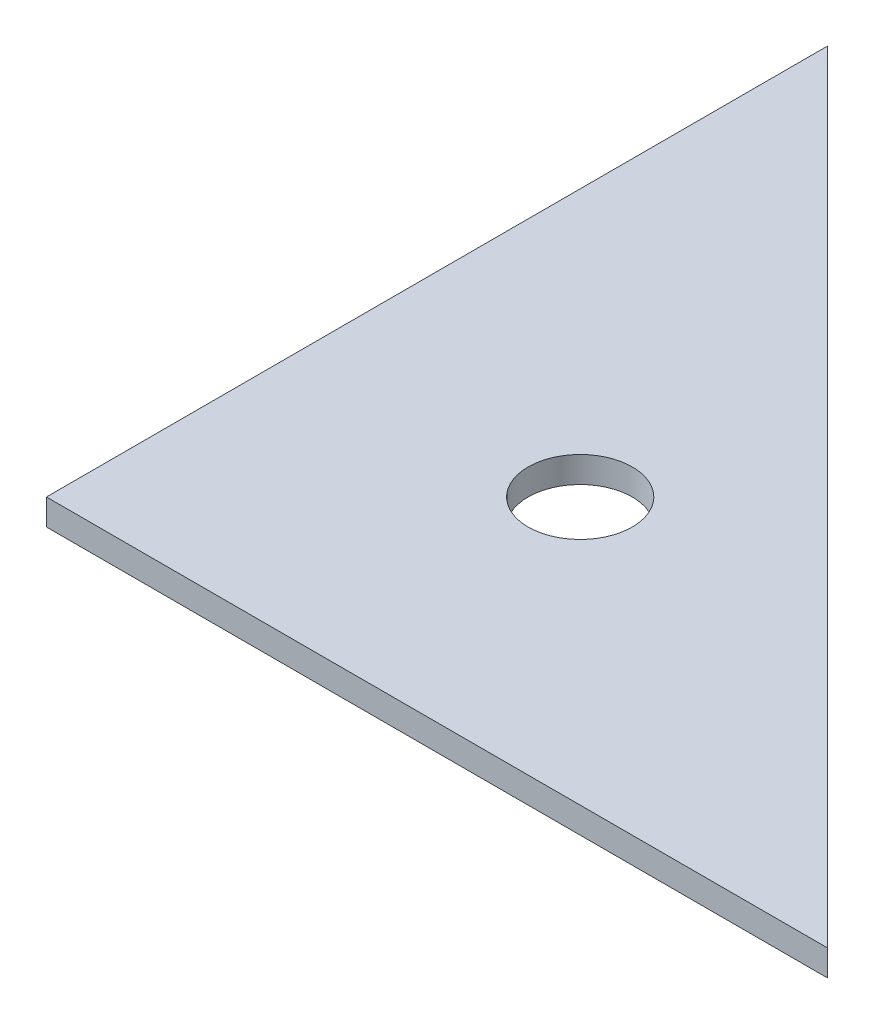
ISO-10303-21;
HEADER;
FILE_DESCRIPTION(('STEP AP214'),'2;1');
FILE_NAME('part.step','',(''),(''),'','','');
FILE_SCHEMA(('AUTOMOTIVE_DESIGN { 1 0 10303 214 1 1 1 1 }'));
ENDSEC;
DATA;
#1=APPLICATION_CONTEXT('core data for automotive mechanical design processes');
#2=APPLICATION_PROTOCOL_DEFINITION('international standard','automotive_design',2000,#1);
#3=PRODUCT_CONTEXT('',#1,'mechanical');
#4=PRODUCT('Part','Part','',(#3));
#5=PRODUCT_RELATED_PRODUCT_CATEGORY('part','',(#4));
#6=PRODUCT_DEFINITION_FORMATION('','',#4);
#7=PRODUCT_DEFINITION_CONTEXT('part definition',#1,'design');
#8=PRODUCT_DEFINITION('design','',#6,#7);
#9=PRODUCT_DEFINITION_SHAPE('','',#8);
#10=(LENGTH_UNIT() NAMED_UNIT(*) SI_UNIT(.MILLI.,.METRE.));
#11=(NAMED_UNIT(*) PLANE_ANGLE_UNIT() SI_UNIT($,.RADIAN.));
#12=(NAMED_UNIT(*) SI_UNIT($,.STERADIAN.) SOLID_ANGLE_UNIT());
#13=UNCERTAINTY_MEASURE_WITH_UNIT(LENGTH_MEASURE(1.E-05),#10,'distance_accuracy_value','');
#14=(GEOMETRIC_REPRESENTATION_CONTEXT(3) GLOBAL_UNCERTAINTY_ASSIGNED_CONTEXT((#13)) GLOBAL_UNIT_ASSIGNED_CONTEXT((#10,
#11,#12)) REPRESENTATION_CONTEXT('',''));
#15=CARTESIAN_POINT('',(0.,0.,0.));
#16=DIRECTION('',(0.,0.,1.));
#17=DIRECTION('',(1.,0.,0.));
#18=AXIS2_PLACEMENT_3D('',#15,#16,#17);
#19=CARTESIAN_POINT('',(0.,2.,0.));
#20=DIRECTION('',(0.,-1.,0.));
#21=DIRECTION('',(0.,0.,-1.));
#22=AXIS2_PLACEMENT_3D('',#19,#20,#21);
#23=PLANE('',#22);
#24=DIRECTION('',(0.,0.,1.));
#25=VECTOR('',#24,1.);
#26=CARTESIAN_POINT('',(0.,2.,0.));
#27=LINE('',#26,#25);
#28=CARTESIAN_POINT('',(0.,2.,-60.));
#29=VERTEX_POINT('',#28);
#30=CARTESIAN_POINT('',(0.,2.,0.));
#31=VERTEX_POINT('',#30);
#32=EDGE_CURVE('E86',#29,#31,#27,.T.);
#33=ORIENTED_EDGE('',*,*,#32,.T.);
#34=DIRECTION('',(1.,0.,0.));
#35=VECTOR('',#34,1.);
#36=CARTESIAN_POINT('',(0.,2.,0.));
#37=LINE('',#36,#35);
#38=CARTESIAN_POINT('',(60.,2.,0.));
#39=VERTEX_POINT('',#38);
#40=EDGE_CURVE('E82',#31,#39,#37,.T.);
#41=ORIENTED_EDGE('',*,*,#40,.T.);
#42=DIRECTION('',(-0.707106781186547,0.,-0.707106781186547));
#43=VECTOR('',#42,1.);
#44=CARTESIAN_POINT('',(0.,2.,-60.));
#45=LINE('',#44,#43);
#46=EDGE_CURVE('E62',#39,#29,#45,.T.);
#47=ORIENTED_EDGE('',*,*,#46,.T.);
#48=EDGE_LOOP('',(#33,#41,#47));
#49=FACE_BOUND('',#48,.T.);
#50=CARTESIAN_POINT('',(20.5,2.,-20.5));
#51=DIRECTION('',(0.,1.,0.));
#52=DIRECTION('',(0.,0.,1.));
#53=AXIS2_PLACEMENT_3D('',#50,#51,#52);
#54=CIRCLE('',#53,4.);
#55=CARTESIAN_POINT('',(20.5,2.,-16.5));
#56=VERTEX_POINT('',#55);
#57=EDGE_CURVE('E96',#56,#56,#54,.T.);
#58=ORIENTED_EDGE('',*,*,#57,.F.);
#59=EDGE_LOOP('',(#58));
#60=FACE_BOUND('',#59,.T.);
#61=ADVANCED_FACE('F45',(#49,#60),#23,.F.);
#62=CARTESIAN_POINT('',(0.,0.,0.));
#63=DIRECTION('',(0.,-1.,0.));
#64=DIRECTION('',(0.,0.,-1.));
#65=AXIS2_PLACEMENT_3D('',#62,#63,#64);
#66=PLANE('',#65);
#67=DIRECTION('',(0.,0.,1.));
#68=VECTOR('',#67,1.);
#69=CARTESIAN_POINT('',(0.,0.,0.));
#70=LINE('',#69,#68);
#71=CARTESIAN_POINT('',(0.,0.,-60.));
#72=VERTEX_POINT('',#71);
#73=CARTESIAN_POINT('',(0.,0.,0.));
#74=VERTEX_POINT('',#73);
#75=EDGE_CURVE('E93',#72,#74,#70,.T.);
#76=ORIENTED_EDGE('',*,*,#75,.F.);
#77=DIRECTION('',(-0.707106781186547,0.,-0.707106781186547));
#78=VECTOR('',#77,1.);
#79=CARTESIAN_POINT('',(0.,0.,-60.));
#80=LINE('',#79,#78);
#81=CARTESIAN_POINT('',(60.,0.,0.));
#82=VERTEX_POINT('',#81);
#83=EDGE_CURVE('E79',#82,#72,#80,.T.);
#84=ORIENTED_EDGE('',*,*,#83,.F.);
#85=DIRECTION('',(1.,0.,0.));
#86=VECTOR('',#85,1.);
#87=CARTESIAN_POINT('',(0.,0.,0.));
#88=LINE('',#87,#86);
#89=EDGE_CURVE('E74',#74,#82,#88,.T.);
#90=ORIENTED_EDGE('',*,*,#89,.F.);
#91=EDGE_LOOP('',(#76,#84,#90));
#92=FACE_BOUND('',#91,.T.);
#93=CARTESIAN_POINT('',(20.5,0.,-20.5));
#94=DIRECTION('',(0.,1.,0.));
#95=DIRECTION('',(0.,0.,1.));
#96=AXIS2_PLACEMENT_3D('',#93,#94,#95);
#97=CIRCLE('',#96,4.);
#98=CARTESIAN_POINT('',(20.5,0.,-16.5));
#99=VERTEX_POINT('',#98);
#100=EDGE_CURVE('E100',#99,#99,#97,.T.);
#101=ORIENTED_EDGE('',*,*,#100,.T.);
#102=EDGE_LOOP('',(#101));
#103=FACE_BOUND('',#102,.T.);
#104=ADVANCED_FACE('F106',(#92,#103),#66,.T.);
#105=CARTESIAN_POINT('',(0.,2.,0.));
#106=DIRECTION('',(1.,0.,0.));
#107=DIRECTION('',(0.,0.,-1.));
#108=AXIS2_PLACEMENT_3D('',#105,#106,#107);
#109=PLANE('',#108);
#110=ORIENTED_EDGE('',*,*,#75,.T.);
#111=DIRECTION('',(0.,-1.,0.));
#112=VECTOR('',#111,1.);
#113=CARTESIAN_POINT('',(0.,2.,0.));
#114=LINE('',#113,#112);
#115=EDGE_CURVE('E13',#31,#74,#114,.T.);
#116=ORIENTED_EDGE('',*,*,#115,.F.);
#117=ORIENTED_EDGE('',*,*,#32,.F.);
#118=DIRECTION('',(0.,-1.,0.));
#119=VECTOR('',#118,1.);
#120=CARTESIAN_POINT('',(0.,2.,-60.));
#121=LINE('',#120,#119);
#122=EDGE_CURVE('E94',#29,#72,#121,.T.);
#123=ORIENTED_EDGE('',*,*,#122,.T.);
#124=EDGE_LOOP('',(#110,#116,#117,#123));
#125=FACE_BOUND('',#124,.T.);
#126=ADVANCED_FACE('F47',(#125),#109,.F.);
#127=CARTESIAN_POINT('',(0.,2.,0.));
#128=DIRECTION('',(0.,0.,-1.));
#129=DIRECTION('',(-1.,0.,0.));
#130=AXIS2_PLACEMENT_3D('',#127,#128,#129);
#131=PLANE('',#130);
#132=ORIENTED_EDGE('',*,*,#89,.T.);
#133=DIRECTION('',(0.,-1.,0.));
#134=VECTOR('',#133,1.);
#135=CARTESIAN_POINT('',(60.,2.,0.));
#136=LINE('',#135,#134);
#137=EDGE_CURVE('E54',#39,#82,#136,.T.);
#138=ORIENTED_EDGE('',*,*,#137,.F.);
#139=ORIENTED_EDGE('',*,*,#40,.F.);
#140=ORIENTED_EDGE('',*,*,#115,.T.);
#141=EDGE_LOOP('',(#132,#138,#139,#140));
#142=FACE_BOUND('',#141,.T.);
#143=ADVANCED_FACE('F83',(#142),#131,.F.);
#144=CARTESIAN_POINT('',(0.,2.,-60.));
#145=DIRECTION('',(-0.707106781186547,0.,0.707106781186547));
#146=DIRECTION('',(0.707106781186548,0.,0.707106781186548));
#147=AXIS2_PLACEMENT_3D('',#144,#145,#146);
#148=PLANE('',#147);
#149=ORIENTED_EDGE('',*,*,#83,.T.);
#150=ORIENTED_EDGE('',*,*,#122,.F.);
#151=ORIENTED_EDGE('',*,*,#46,.F.);
#152=ORIENTED_EDGE('',*,*,#137,.T.);
#153=EDGE_LOOP('',(#149,#150,#151,#152));
#154=FACE_BOUND('',#153,.T.);
#155=ADVANCED_FACE('F105',(#154),#148,.F.);
#156=CARTESIAN_POINT('',(20.5,2.,-20.5));
#157=DIRECTION('',(0.,-1.,0.));
#158=DIRECTION('',(0.,0.,-1.));
#159=AXIS2_PLACEMENT_3D('',#156,#157,#158);
#160=CYLINDRICAL_SURFACE('',#159,4.);
#161=ORIENTED_EDGE('',*,*,#57,.T.);
#162=EDGE_LOOP('',(#161));
#163=FACE_BOUND('',#162,.T.);
#164=ORIENTED_EDGE('',*,*,#100,.F.);
#165=EDGE_LOOP('',(#164));
#166=FACE_BOUND('',#165,.T.);
#167=ADVANCED_FACE('F114',(#163,#166),#160,.F.);
#168=CLOSED_SHELL('',(#61,#104,#126,#143,#155,#167));
#169=MANIFOLD_SOLID_BREP('B2',#168);
#170=ADVANCED_BREP_SHAPE_REPRESENTATION('',(#18,#169),#14);
#171=SHAPE_DEFINITION_REPRESENTATION(#9,#170);
ENDSEC;
END-ISO-10303-21;
